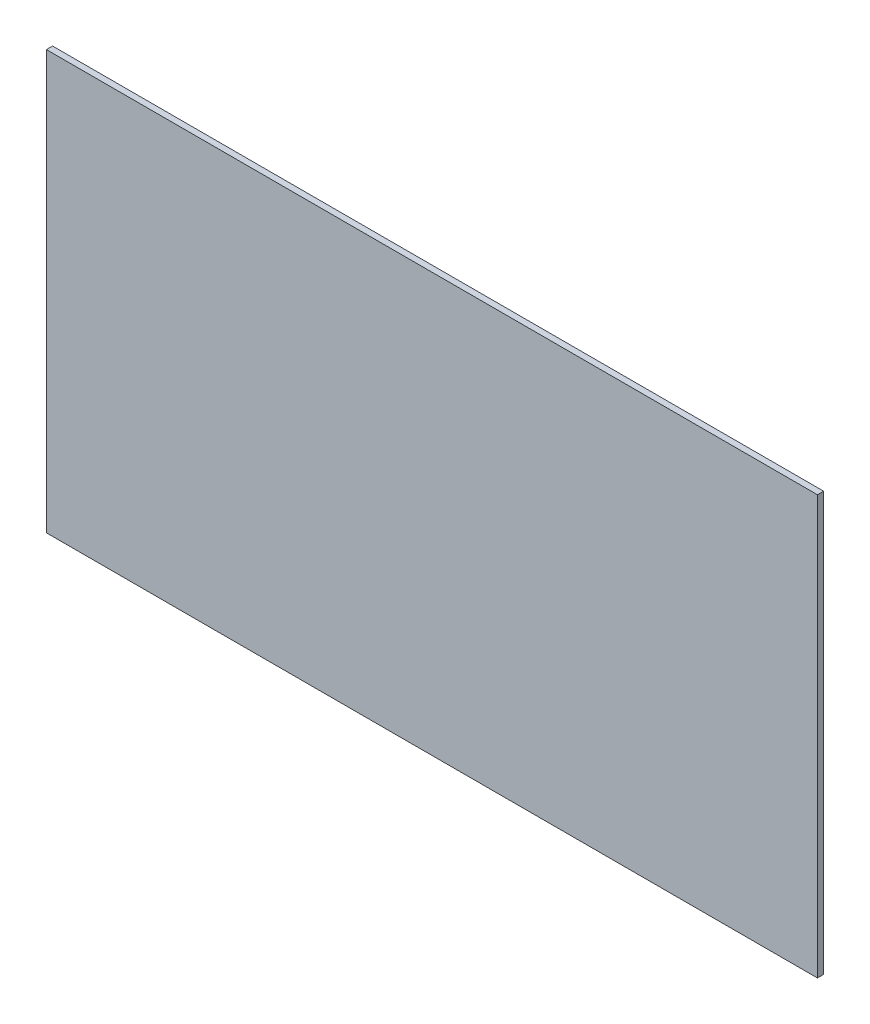
ISO-10303-21;
HEADER;
FILE_DESCRIPTION(('STEP AP214'),'2;1');
FILE_NAME('part.step','',(''),(''),'','','');
FILE_SCHEMA(('AUTOMOTIVE_DESIGN { 1 0 10303 214 1 1 1 1 }'));
ENDSEC;
DATA;
#1=APPLICATION_CONTEXT('core data for automotive mechanical design processes');
#2=APPLICATION_PROTOCOL_DEFINITION('international standard','automotive_design',2000,#1);
#3=PRODUCT_CONTEXT('',#1,'mechanical');
#4=PRODUCT('Part','Part','',(#3));
#5=PRODUCT_RELATED_PRODUCT_CATEGORY('part','',(#4));
#6=PRODUCT_DEFINITION_FORMATION('','',#4);
#7=PRODUCT_DEFINITION_CONTEXT('part definition',#1,'design');
#8=PRODUCT_DEFINITION('design','',#6,#7);
#9=PRODUCT_DEFINITION_SHAPE('','',#8);
#10=(LENGTH_UNIT() NAMED_UNIT(*) SI_UNIT(.MILLI.,.METRE.));
#11=(NAMED_UNIT(*) PLANE_ANGLE_UNIT() SI_UNIT($,.RADIAN.));
#12=(NAMED_UNIT(*) SI_UNIT($,.STERADIAN.) SOLID_ANGLE_UNIT());
#13=UNCERTAINTY_MEASURE_WITH_UNIT(LENGTH_MEASURE(1.E-05),#10,'distance_accuracy_value','');
#14=(GEOMETRIC_REPRESENTATION_CONTEXT(3) GLOBAL_UNCERTAINTY_ASSIGNED_CONTEXT((#13)) GLOBAL_UNIT_ASSIGNED_CONTEXT((#10,
#11,#12)) REPRESENTATION_CONTEXT('',''));
#15=CARTESIAN_POINT('',(0.,0.,0.));
#16=DIRECTION('',(0.,0.,1.));
#17=DIRECTION('',(1.,0.,0.));
#18=AXIS2_PLACEMENT_3D('',#15,#16,#17);
#19=CARTESIAN_POINT('',(0.,0.,3.));
#20=DIRECTION('',(1.,0.,0.));
#21=DIRECTION('',(0.,0.,-1.));
#22=AXIS2_PLACEMENT_3D('',#19,#20,#21);
#23=PLANE('',#22);
#24=DIRECTION('',(0.,-1.,0.));
#25=VECTOR('',#24,1.);
#26=CARTESIAN_POINT('',(0.,0.,0.));
#27=LINE('',#26,#25);
#28=CARTESIAN_POINT('',(0.,203.,0.));
#29=VERTEX_POINT('',#28);
#30=CARTESIAN_POINT('',(0.,0.,0.));
#31=VERTEX_POINT('',#30);
#32=EDGE_CURVE('E96',#29,#31,#27,.T.);
#33=ORIENTED_EDGE('',*,*,#32,.T.);
#34=DIRECTION('',(0.,0.,-1.));
#35=VECTOR('',#34,1.);
#36=CARTESIAN_POINT('',(0.,0.,3.));
#37=LINE('',#36,#35);
#38=CARTESIAN_POINT('',(0.,0.,3.));
#39=VERTEX_POINT('',#38);
#40=EDGE_CURVE('E11',#39,#31,#37,.T.);
#41=ORIENTED_EDGE('',*,*,#40,.F.);
#42=DIRECTION('',(0.,-1.,0.));
#43=VECTOR('',#42,1.);
#44=CARTESIAN_POINT('',(0.,0.,3.));
#45=LINE('',#44,#43);
#46=CARTESIAN_POINT('',(0.,203.,3.));
#47=VERTEX_POINT('',#46);
#48=EDGE_CURVE('E84',#47,#39,#45,.T.);
#49=ORIENTED_EDGE('',*,*,#48,.F.);
#50=DIRECTION('',(0.,0.,-1.));
#51=VECTOR('',#50,1.);
#52=CARTESIAN_POINT('',(0.,203.,3.));
#53=LINE('',#52,#51);
#54=EDGE_CURVE('E92',#47,#29,#53,.T.);
#55=ORIENTED_EDGE('',*,*,#54,.T.);
#56=EDGE_LOOP('',(#33,#41,#49,#55));
#57=FACE_BOUND('',#56,.T.);
#58=ADVANCED_FACE('F33',(#57),#23,.F.);
#59=CARTESIAN_POINT('',(0.,0.,3.));
#60=DIRECTION('',(0.,1.,0.));
#61=DIRECTION('',(0.,0.,1.));
#62=AXIS2_PLACEMENT_3D('',#59,#60,#61);
#63=PLANE('',#62);
#64=DIRECTION('',(1.,0.,0.));
#65=VECTOR('',#64,1.);
#66=CARTESIAN_POINT('',(0.,0.,0.));
#67=LINE('',#66,#65);
#68=CARTESIAN_POINT('',(374.,0.,0.));
#69=VERTEX_POINT('',#68);
#70=EDGE_CURVE('E88',#31,#69,#67,.T.);
#71=ORIENTED_EDGE('',*,*,#70,.T.);
#72=DIRECTION('',(0.,0.,-1.));
#73=VECTOR('',#72,1.);
#74=CARTESIAN_POINT('',(374.,0.,3.));
#75=LINE('',#74,#73);
#76=CARTESIAN_POINT('',(374.,0.,3.));
#77=VERTEX_POINT('',#76);
#78=EDGE_CURVE('E41',#77,#69,#75,.T.);
#79=ORIENTED_EDGE('',*,*,#78,.F.);
#80=DIRECTION('',(1.,0.,0.));
#81=VECTOR('',#80,1.);
#82=CARTESIAN_POINT('',(0.,0.,3.));
#83=LINE('',#82,#81);
#84=EDGE_CURVE('E79',#39,#77,#83,.T.);
#85=ORIENTED_EDGE('',*,*,#84,.F.);
#86=ORIENTED_EDGE('',*,*,#40,.T.);
#87=EDGE_LOOP('',(#71,#79,#85,#86));
#88=FACE_BOUND('',#87,.T.);
#89=ADVANCED_FACE('F87',(#88),#63,.F.);
#90=CARTESIAN_POINT('',(374.,0.,3.));
#91=DIRECTION('',(-1.,0.,0.));
#92=DIRECTION('',(0.,0.,1.));
#93=AXIS2_PLACEMENT_3D('',#90,#91,#92);
#94=PLANE('',#93);
#95=DIRECTION('',(0.,1.,0.));
#96=VECTOR('',#95,1.);
#97=CARTESIAN_POINT('',(374.,0.,0.));
#98=LINE('',#97,#96);
#99=CARTESIAN_POINT('',(374.,203.,0.));
#100=VERTEX_POINT('',#99);
#101=EDGE_CURVE('E66',#69,#100,#98,.T.);
#102=ORIENTED_EDGE('',*,*,#101,.T.);
#103=DIRECTION('',(0.,0.,-1.));
#104=VECTOR('',#103,1.);
#105=CARTESIAN_POINT('',(374.,203.,3.));
#106=LINE('',#105,#104);
#107=CARTESIAN_POINT('',(374.,203.,3.));
#108=VERTEX_POINT('',#107);
#109=EDGE_CURVE('E89',#108,#100,#106,.T.);
#110=ORIENTED_EDGE('',*,*,#109,.F.);
#111=DIRECTION('',(0.,1.,0.));
#112=VECTOR('',#111,1.);
#113=CARTESIAN_POINT('',(374.,0.,3.));
#114=LINE('',#113,#112);
#115=EDGE_CURVE('E82',#77,#108,#114,.T.);
#116=ORIENTED_EDGE('',*,*,#115,.F.);
#117=ORIENTED_EDGE('',*,*,#78,.T.);
#118=EDGE_LOOP('',(#102,#110,#116,#117));
#119=FACE_BOUND('',#118,.T.);
#120=ADVANCED_FACE('F90',(#119),#94,.F.);
#121=CARTESIAN_POINT('',(0.,203.,3.));
#122=DIRECTION('',(0.,-1.,0.));
#123=DIRECTION('',(0.,0.,-1.));
#124=AXIS2_PLACEMENT_3D('',#121,#122,#123);
#125=PLANE('',#124);
#126=DIRECTION('',(-1.,0.,0.));
#127=VECTOR('',#126,1.);
#128=CARTESIAN_POINT('',(0.,203.,0.));
#129=LINE('',#128,#127);
#130=EDGE_CURVE('E72',#100,#29,#129,.T.);
#131=ORIENTED_EDGE('',*,*,#130,.T.);
#132=ORIENTED_EDGE('',*,*,#54,.F.);
#133=DIRECTION('',(-1.,0.,0.));
#134=VECTOR('',#133,1.);
#135=CARTESIAN_POINT('',(0.,203.,3.));
#136=LINE('',#135,#134);
#137=EDGE_CURVE('E49',#108,#47,#136,.T.);
#138=ORIENTED_EDGE('',*,*,#137,.F.);
#139=ORIENTED_EDGE('',*,*,#109,.T.);
#140=EDGE_LOOP('',(#131,#132,#138,#139));
#141=FACE_BOUND('',#140,.T.);
#142=ADVANCED_FACE('F103',(#141),#125,.F.);
#143=CARTESIAN_POINT('',(0.,0.,3.));
#144=DIRECTION('',(0.,0.,-1.));
#145=DIRECTION('',(-1.,0.,0.));
#146=AXIS2_PLACEMENT_3D('',#143,#144,#145);
#147=PLANE('',#146);
#148=ORIENTED_EDGE('',*,*,#48,.T.);
#149=ORIENTED_EDGE('',*,*,#84,.T.);
#150=ORIENTED_EDGE('',*,*,#115,.T.);
#151=ORIENTED_EDGE('',*,*,#137,.T.);
#152=EDGE_LOOP('',(#148,#149,#150,#151));
#153=FACE_BOUND('',#152,.T.);
#154=ADVANCED_FACE('F80',(#153),#147,.F.);
#155=CARTESIAN_POINT('',(0.,0.,0.));
#156=DIRECTION('',(0.,0.,-1.));
#157=DIRECTION('',(-1.,0.,0.));
#158=AXIS2_PLACEMENT_3D('',#155,#156,#157);
#159=PLANE('',#158);
#160=ORIENTED_EDGE('',*,*,#32,.F.);
#161=ORIENTED_EDGE('',*,*,#130,.F.);
#162=ORIENTED_EDGE('',*,*,#101,.F.);
#163=ORIENTED_EDGE('',*,*,#70,.F.);
#164=EDGE_LOOP('',(#160,#161,#162,#163));
#165=FACE_BOUND('',#164,.T.);
#166=ADVANCED_FACE('F106',(#165),#159,.T.);
#167=CLOSED_SHELL('',(#58,#89,#120,#142,#154,#166));
#168=MANIFOLD_SOLID_BREP('B2',#167);
#169=ADVANCED_BREP_SHAPE_REPRESENTATION('',(#18,#168),#14);
#170=SHAPE_DEFINITION_REPRESENTATION(#9,#169);
ENDSEC;
END-ISO-10303-21;
